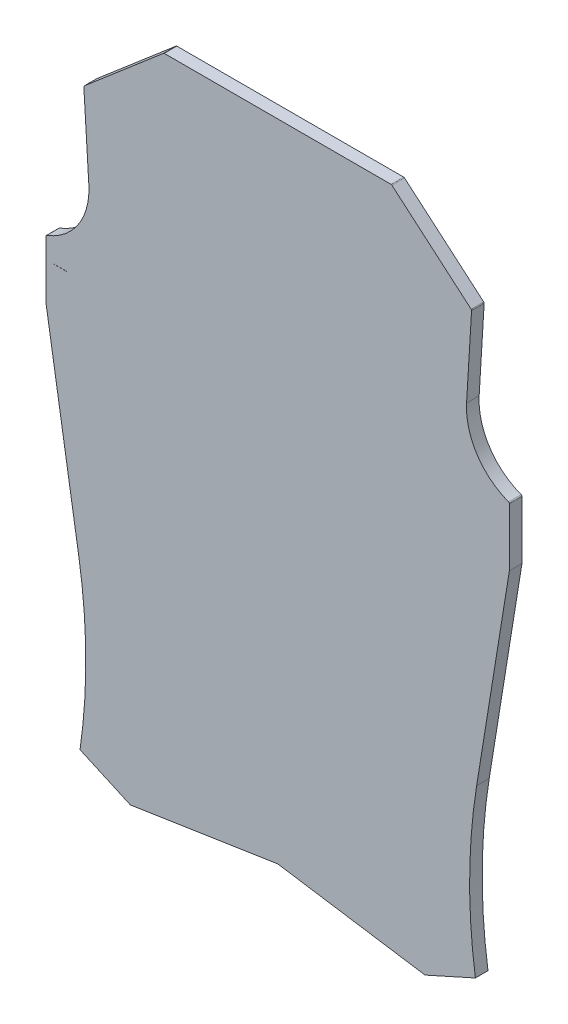
ISO-10303-21;
HEADER;
FILE_DESCRIPTION(('STEP AP214'),'2;1');
FILE_NAME('part.step','',(''),(''),'','','');
FILE_SCHEMA(('AUTOMOTIVE_DESIGN { 1 0 10303 214 1 1 1 1 }'));
ENDSEC;
DATA;
#1=APPLICATION_CONTEXT('core data for automotive mechanical design processes');
#2=APPLICATION_PROTOCOL_DEFINITION('international standard','automotive_design',2000,#1);
#3=PRODUCT_CONTEXT('',#1,'mechanical');
#4=PRODUCT('Part','Part','',(#3));
#5=PRODUCT_RELATED_PRODUCT_CATEGORY('part','',(#4));
#6=PRODUCT_DEFINITION_FORMATION('','',#4);
#7=PRODUCT_DEFINITION_CONTEXT('part definition',#1,'design');
#8=PRODUCT_DEFINITION('design','',#6,#7);
#9=PRODUCT_DEFINITION_SHAPE('','',#8);
#10=(LENGTH_UNIT() NAMED_UNIT(*) SI_UNIT(.MILLI.,.METRE.));
#11=(NAMED_UNIT(*) PLANE_ANGLE_UNIT() SI_UNIT($,.RADIAN.));
#12=(NAMED_UNIT(*) SI_UNIT($,.STERADIAN.) SOLID_ANGLE_UNIT());
#13=UNCERTAINTY_MEASURE_WITH_UNIT(LENGTH_MEASURE(1.E-05),#10,'distance_accuracy_value','');
#14=(GEOMETRIC_REPRESENTATION_CONTEXT(3) GLOBAL_UNCERTAINTY_ASSIGNED_CONTEXT((#13)) GLOBAL_UNIT_ASSIGNED_CONTEXT((#10,
#11,#12)) REPRESENTATION_CONTEXT('',''));
#15=CARTESIAN_POINT('',(0.,0.,0.));
#16=DIRECTION('',(0.,0.,1.));
#17=DIRECTION('',(1.,0.,0.));
#18=AXIS2_PLACEMENT_3D('',#15,#16,#17);
#19=CARTESIAN_POINT('',(-81.9999999982469,-43.2999988699775,5.));
#20=DIRECTION('',(0.00811581332094345,-0.999967066244754,0.));
#21=DIRECTION('',(0.999967066244754,0.00811581332094345,0.));
#22=AXIS2_PLACEMENT_3D('',#19,#20,#21);
#23=PLANE('',#22);
#24=DIRECTION('',(-0.999967066244754,-0.00811581332094345,0.));
#25=VECTOR('',#24,1.);
#26=CARTESIAN_POINT('',(-81.9999999982469,-43.2999988699775,0.));
#27=LINE('',#26,#25);
#28=CARTESIAN_POINT('',(-83.6296001949522,-43.3132248365425,0.));
#29=VERTEX_POINT('',#28);
#30=CARTESIAN_POINT('',(-91.9933779749734,-43.3811059312423,0.));
#31=VERTEX_POINT('',#30);
#32=EDGE_CURVE('E890',#29,#31,#27,.T.);
#33=ORIENTED_EDGE('',*,*,#32,.F.);
#34=DIRECTION('',(0.,0.,1.));
#35=VECTOR('',#34,1.);
#36=CARTESIAN_POINT('',(-83.6296001949522,-43.3132248365425,5.));
#37=LINE('',#36,#35);
#38=CARTESIAN_POINT('',(-83.6296001949522,-43.3132248365425,5.));
#39=VERTEX_POINT('',#38);
#40=EDGE_CURVE('E790',#29,#39,#37,.T.);
#41=ORIENTED_EDGE('',*,*,#40,.T.);
#42=DIRECTION('',(-0.999967066244754,-0.00811581332094345,0.));
#43=VECTOR('',#42,1.);
#44=CARTESIAN_POINT('',(-81.9999999982469,-43.2999988699775,5.));
#45=LINE('',#44,#43);
#46=CARTESIAN_POINT('',(-91.9933779749734,-43.3811059312423,5.));
#47=VERTEX_POINT('',#46);
#48=EDGE_CURVE('E802',#39,#47,#45,.T.);
#49=ORIENTED_EDGE('',*,*,#48,.T.);
#50=DIRECTION('',(0.,0.,-1.));
#51=VECTOR('',#50,1.);
#52=CARTESIAN_POINT('',(-91.9933779749734,-43.3811059312423,5.));
#53=LINE('',#52,#51);
#54=EDGE_CURVE('E12',#47,#31,#53,.T.);
#55=ORIENTED_EDGE('',*,*,#54,.T.);
#56=EDGE_LOOP('',(#33,#41,#49,#55));
#57=FACE_BOUND('',#56,.T.);
#58=ADVANCED_FACE('F549',(#57),#23,.T.);
#59=CARTESIAN_POINT('',(-294.37088942665,-173.62365127446,5.));
#60=DIRECTION('',(0.,0.,-1.));
#61=DIRECTION('',(-1.,0.,0.));
#62=AXIS2_PLACEMENT_3D('',#59,#60,#61);
#63=CYLINDRICAL_SURFACE('',#62,228.168069847329);
#64=CARTESIAN_POINT('',(-294.37088942665,-173.62365127446,5.));
#65=DIRECTION('',(0.,0.,1.));
#66=DIRECTION('',(1.,0.,0.));
#67=AXIS2_PLACEMENT_3D('',#64,#65,#66);
#68=CIRCLE('',#67,228.168069847329);
#69=CARTESIAN_POINT('',(-68.9999179184498,-138.006333866975,5.));
#70=VERTEX_POINT('',#69);
#71=CARTESIAN_POINT('',(-68.9902374176348,-138.067641967358,5.));
#72=VERTEX_POINT('',#71);
#73=EDGE_CURVE('E806',#70,#72,#68,.F.);
#74=ORIENTED_EDGE('',*,*,#73,.T.);
#75=DIRECTION('',(0.,0.,-1.));
#76=VECTOR('',#75,1.);
#77=CARTESIAN_POINT('',(-68.9902374176348,-138.067641967358,5.));
#78=LINE('',#77,#76);
#79=CARTESIAN_POINT('',(-68.9902374176348,-138.067641967358,0.));
#80=VERTEX_POINT('',#79);
#81=EDGE_CURVE('E794',#72,#80,#78,.T.);
#82=ORIENTED_EDGE('',*,*,#81,.T.);
#83=CARTESIAN_POINT('',(-294.37088942665,-173.62365127446,0.));
#84=DIRECTION('',(0.,0.,1.));
#85=DIRECTION('',(1.,0.,0.));
#86=AXIS2_PLACEMENT_3D('',#83,#84,#85);
#87=CIRCLE('',#86,228.168069847329);
#88=CARTESIAN_POINT('',(-68.9999179184498,-138.006333866975,0.));
#89=VERTEX_POINT('',#88);
#90=EDGE_CURVE('E772',#89,#80,#87,.F.);
#91=ORIENTED_EDGE('',*,*,#90,.F.);
#92=DIRECTION('',(0.,0.,-1.));
#93=VECTOR('',#92,1.);
#94=CARTESIAN_POINT('',(-68.9999179184498,-138.006333866975,5.));
#95=LINE('',#94,#93);
#96=EDGE_CURVE('E759',#89,#70,#95,.F.);
#97=ORIENTED_EDGE('',*,*,#96,.T.);
#98=EDGE_LOOP('',(#74,#82,#91,#97));
#99=FACE_BOUND('',#98,.T.);
#100=ADVANCED_FACE('F1210',(#99),#63,.T.);
#101=CARTESIAN_POINT('',(-91.9966889876257,-43.3816502251422,5.));
#102=DIRECTION('',(0.000220464357492817,0.999999975697733,0.));
#103=DIRECTION('',(-0.999999975697733,0.000220464357492817,0.));
#104=AXIS2_PLACEMENT_3D('',#101,#102,#103);
#105=PLANE('',#104);
#106=DIRECTION('',(0.999999975697733,-0.000220464357492817,0.));
#107=VECTOR('',#106,1.);
#108=CARTESIAN_POINT('',(-91.9966889876257,-43.3816502251422,5.));
#109=LINE('',#108,#107);
#110=CARTESIAN_POINT('',(-91.9966889876257,-43.3816502251422,5.));
#111=VERTEX_POINT('',#110);
#112=CARTESIAN_POINT('',(-83.6296001949522,-43.3834948700418,5.));
#113=VERTEX_POINT('',#112);
#114=EDGE_CURVE('E810',#111,#113,#109,.T.);
#115=ORIENTED_EDGE('',*,*,#114,.T.);
#116=DIRECTION('',(0.,0.,-1.));
#117=VECTOR('',#116,1.);
#118=CARTESIAN_POINT('',(-83.6296001949522,-43.3834948700418,5.));
#119=LINE('',#118,#117);
#120=CARTESIAN_POINT('',(-83.6296001949522,-43.3834948700418,0.));
#121=VERTEX_POINT('',#120);
#122=EDGE_CURVE('E787',#113,#121,#119,.T.);
#123=ORIENTED_EDGE('',*,*,#122,.T.);
#124=DIRECTION('',(0.999999975697733,-0.000220464357492817,0.));
#125=VECTOR('',#124,1.);
#126=CARTESIAN_POINT('',(-91.9966889876257,-43.3816502251422,0.));
#127=LINE('',#126,#125);
#128=CARTESIAN_POINT('',(-91.9966889876257,-43.3816502251422,0.));
#129=VERTEX_POINT('',#128);
#130=EDGE_CURVE('E895',#129,#121,#127,.T.);
#131=ORIENTED_EDGE('',*,*,#130,.F.);
#132=DIRECTION('',(0.,0.,-1.));
#133=VECTOR('',#132,1.);
#134=CARTESIAN_POINT('',(-91.9966889876257,-43.3816502251422,5.));
#135=LINE('',#134,#133);
#136=EDGE_CURVE('E558',#111,#129,#135,.T.);
#137=ORIENTED_EDGE('',*,*,#136,.F.);
#138=EDGE_LOOP('',(#115,#123,#131,#137));
#139=FACE_BOUND('',#138,.T.);
#140=ADVANCED_FACE('F1077',(#139),#105,.T.);
#141=CARTESIAN_POINT('',(-91.4999999982474,-43.3000000000009,5.));
#142=DIRECTION('',(0.,0.,-1.));
#143=DIRECTION('',(-1.,0.,0.));
#144=AXIS2_PLACEMENT_3D('',#141,#142,#143);
#145=CYLINDRICAL_SURFACE('',#144,0.500000000000781);
#146=CARTESIAN_POINT('',(-91.4999999982474,-43.3000000000009,0.));
#147=DIRECTION('',(0.,0.,1.));
#148=DIRECTION('',(1.,0.,0.));
#149=AXIS2_PLACEMENT_3D('',#146,#147,#148);
#150=CIRCLE('',#149,0.500000000000781);
#151=CARTESIAN_POINT('',(-91.9999999982469,-43.2999988699775,0.));
#152=VERTEX_POINT('',#151);
#153=EDGE_CURVE('E797',#152,#31,#150,.T.);
#154=ORIENTED_EDGE('',*,*,#153,.T.);
#155=ORIENTED_EDGE('',*,*,#54,.F.);
#156=CARTESIAN_POINT('',(-91.4999999982474,-43.3000000000009,5.));
#157=DIRECTION('',(0.,0.,1.));
#158=DIRECTION('',(1.,0.,0.));
#159=AXIS2_PLACEMENT_3D('',#156,#157,#158);
#160=CIRCLE('',#159,0.500000000000781);
#161=CARTESIAN_POINT('',(-91.9999999982469,-43.2999988699775,5.));
#162=VERTEX_POINT('',#161);
#163=EDGE_CURVE('E798',#162,#47,#160,.T.);
#164=ORIENTED_EDGE('',*,*,#163,.F.);
#165=DIRECTION('',(0.,0.,-1.));
#166=VECTOR('',#165,1.);
#167=CARTESIAN_POINT('',(-91.9999999982469,-43.2999988699775,5.));
#168=LINE('',#167,#166);
#169=EDGE_CURVE('E886',#162,#152,#168,.T.);
#170=ORIENTED_EDGE('',*,*,#169,.T.);
#171=EDGE_LOOP('',(#154,#155,#164,#170));
#172=FACE_BOUND('',#171,.T.);
#173=ADVANCED_FACE('F551',(#172),#145,.T.);
#174=CARTESIAN_POINT('',(-91.9966889876257,-43.3816502251422,5.));
#175=DIRECTION('',(0.999999975697733,-0.000220464357492976,0.));
#176=DIRECTION('',(0.000220464357492976,0.999999975697733,0.));
#177=AXIS2_PLACEMENT_3D('',#174,#175,#176);
#178=PLANE('',#177);
#179=DIRECTION('',(-0.000220464357492976,-0.999999975697733,0.));
#180=VECTOR('',#179,1.);
#181=CARTESIAN_POINT('',(-91.9966889876257,-43.3816502251422,0.));
#182=LINE('',#181,#180);
#183=CARTESIAN_POINT('',(-91.9999999985399,-58.4000000001,0.));
#184=VERTEX_POINT('',#183);
#185=EDGE_CURVE('E899',#129,#184,#182,.T.);
#186=ORIENTED_EDGE('',*,*,#185,.T.);
#187=DIRECTION('',(0.,0.,-1.));
#188=VECTOR('',#187,1.);
#189=CARTESIAN_POINT('',(-91.9999999985399,-58.4000000001,5.));
#190=LINE('',#189,#188);
#191=CARTESIAN_POINT('',(-91.9999999985399,-58.4000000001,5.));
#192=VERTEX_POINT('',#191);
#193=EDGE_CURVE('E1062',#192,#184,#190,.T.);
#194=ORIENTED_EDGE('',*,*,#193,.F.);
#195=DIRECTION('',(-0.000220464357492976,-0.999999975697733,0.));
#196=VECTOR('',#195,1.);
#197=CARTESIAN_POINT('',(-91.9966889876257,-43.3816502251422,5.));
#198=LINE('',#197,#196);
#199=EDGE_CURVE('E814',#111,#192,#198,.T.);
#200=ORIENTED_EDGE('',*,*,#199,.F.);
#201=ORIENTED_EDGE('',*,*,#136,.T.);
#202=EDGE_LOOP('',(#186,#194,#200,#201));
#203=FACE_BOUND('',#202,.T.);
#204=ADVANCED_FACE('F1069',(#203),#178,.F.);
#205=CARTESIAN_POINT('',(-91.9999999985399,-58.4000000001,5.));
#206=DIRECTION('',(0.987178781836989,0.15961845974335,0.));
#207=DIRECTION('',(-0.15961845974335,0.987178781836989,0.));
#208=AXIS2_PLACEMENT_3D('',#205,#206,#207);
#209=PLANE('',#208);
#210=DIRECTION('',(0.15961845974335,-0.987178781836989,0.));
#211=VECTOR('',#210,1.);
#212=CARTESIAN_POINT('',(-91.9999999985399,-58.4000000001,0.));
#213=LINE('',#212,#211);
#214=CARTESIAN_POINT('',(-79.0000000055876,-138.799999959736,0.));
#215=VERTEX_POINT('',#214);
#216=EDGE_CURVE('E902',#184,#215,#213,.T.);
#217=ORIENTED_EDGE('',*,*,#216,.T.);
#218=DIRECTION('',(0.,0.,-1.));
#219=VECTOR('',#218,1.);
#220=CARTESIAN_POINT('',(-79.0000000055876,-138.799999959736,5.));
#221=LINE('',#220,#219);
#222=CARTESIAN_POINT('',(-79.0000000055876,-138.799999959736,5.));
#223=VERTEX_POINT('',#222);
#224=EDGE_CURVE('E1058',#223,#215,#221,.T.);
#225=ORIENTED_EDGE('',*,*,#224,.F.);
#226=DIRECTION('',(0.15961845974335,-0.987178781836989,0.));
#227=VECTOR('',#226,1.);
#228=CARTESIAN_POINT('',(-91.9999999985399,-58.4000000001,5.));
#229=LINE('',#228,#227);
#230=EDGE_CURVE('E817',#192,#223,#229,.T.);
#231=ORIENTED_EDGE('',*,*,#230,.F.);
#232=ORIENTED_EDGE('',*,*,#193,.T.);
#233=EDGE_LOOP('',(#217,#225,#231,#232));
#234=FACE_BOUND('',#233,.T.);
#235=ADVANCED_FACE('F1200',(#234),#209,.F.);
#236=CARTESIAN_POINT('',(-294.37088942665,-173.62365127446,5.));
#237=DIRECTION('',(0.,0.,-1.));
#238=DIRECTION('',(-1.,0.,0.));
#239=AXIS2_PLACEMENT_3D('',#236,#237,#238);
#240=CYLINDRICAL_SURFACE('',#239,218.168069847329);
#241=CARTESIAN_POINT('',(-294.37088942665,-173.62365127446,0.));
#242=DIRECTION('',(0.,0.,-1.));
#243=DIRECTION('',(1.,0.,0.));
#244=AXIS2_PLACEMENT_3D('',#241,#242,#243);
#245=CIRCLE('',#244,218.168069847329);
#246=CARTESIAN_POINT('',(-78.4999999992825,-205.199999998572,0.));
#247=VERTEX_POINT('',#246);
#248=EDGE_CURVE('E905',#215,#247,#245,.T.);
#249=ORIENTED_EDGE('',*,*,#248,.T.);
#250=DIRECTION('',(0.,0.,-1.));
#251=VECTOR('',#250,1.);
#252=CARTESIAN_POINT('',(-78.4999999992825,-205.199999998572,5.));
#253=LINE('',#252,#251);
#254=CARTESIAN_POINT('',(-78.4999999992825,-205.199999998572,5.));
#255=VERTEX_POINT('',#254);
#256=EDGE_CURVE('E1054',#255,#247,#253,.T.);
#257=ORIENTED_EDGE('',*,*,#256,.F.);
#258=CARTESIAN_POINT('',(-294.37088942665,-173.62365127446,5.));
#259=DIRECTION('',(0.,0.,-1.));
#260=DIRECTION('',(1.,0.,0.));
#261=AXIS2_PLACEMENT_3D('',#258,#259,#260);
#262=CIRCLE('',#261,218.168069847329);
#263=EDGE_CURVE('E820',#223,#255,#262,.T.);
#264=ORIENTED_EDGE('',*,*,#263,.F.);
#265=ORIENTED_EDGE('',*,*,#224,.T.);
#266=EDGE_LOOP('',(#249,#257,#264,#265));
#267=FACE_BOUND('',#266,.T.);
#268=ADVANCED_FACE('F1196',(#267),#240,.F.);
#269=CARTESIAN_POINT('',(-78.4999999992825,-205.199999998572,5.));
#270=DIRECTION('',(0.410364677356085,0.911921505162827,0.));
#271=DIRECTION('',(-0.911921505162827,0.410364677356085,0.));
#272=AXIS2_PLACEMENT_3D('',#269,#270,#271);
#273=PLANE('',#272);
#274=DIRECTION('',(0.911921505162827,-0.410364677356085,0.));
#275=VECTOR('',#274,1.);
#276=CARTESIAN_POINT('',(-78.4999999992825,-205.199999998572,0.));
#277=LINE('',#276,#275);
#278=CARTESIAN_POINT('',(-58.4999999984207,-214.199999999679,0.));
#279=VERTEX_POINT('',#278);
#280=EDGE_CURVE('E908',#247,#279,#277,.T.);
#281=ORIENTED_EDGE('',*,*,#280,.T.);
#282=DIRECTION('',(0.,0.,-1.));
#283=VECTOR('',#282,1.);
#284=CARTESIAN_POINT('',(-58.4999999984207,-214.199999999679,5.));
#285=LINE('',#284,#283);
#286=CARTESIAN_POINT('',(-58.4999999984207,-214.199999999679,5.));
#287=VERTEX_POINT('',#286);
#288=EDGE_CURVE('E1050',#287,#279,#285,.T.);
#289=ORIENTED_EDGE('',*,*,#288,.F.);
#290=DIRECTION('',(0.911921505162827,-0.410364677356085,0.));
#291=VECTOR('',#290,1.);
#292=CARTESIAN_POINT('',(-78.4999999992825,-205.199999998572,5.));
#293=LINE('',#292,#291);
#294=EDGE_CURVE('E823',#255,#287,#293,.T.);
#295=ORIENTED_EDGE('',*,*,#294,.F.);
#296=ORIENTED_EDGE('',*,*,#256,.T.);
#297=EDGE_LOOP('',(#281,#289,#295,#296));
#298=FACE_BOUND('',#297,.T.);
#299=ADVANCED_FACE('F1191',(#298),#273,.F.);
#300=CARTESIAN_POINT('',(-58.4999999984207,-214.199999999679,5.));
#301=DIRECTION('',(-0.15205718427004,0.98837169764814,0.));
#302=DIRECTION('',(-0.98837169764814,-0.15205718427004,0.));
#303=AXIS2_PLACEMENT_3D('',#300,#301,#302);
#304=PLANE('',#303);
#305=DIRECTION('',(0.98837169764814,0.15205718427004,0.));
#306=VECTOR('',#305,1.);
#307=CARTESIAN_POINT('',(-58.4999999984207,-214.199999999679,0.));
#308=LINE('',#307,#306);
#309=CARTESIAN_POINT('',(1.59900452976804E-09,-205.1999999987,0.));
#310=VERTEX_POINT('',#309);
#311=EDGE_CURVE('E911',#279,#310,#308,.T.);
#312=ORIENTED_EDGE('',*,*,#311,.T.);
#313=DIRECTION('',(0.,0.,-1.));
#314=VECTOR('',#313,1.);
#315=CARTESIAN_POINT('',(1.59900452976804E-09,-205.1999999987,5.));
#316=LINE('',#315,#314);
#317=CARTESIAN_POINT('',(1.59900452976804E-09,-205.1999999987,5.));
#318=VERTEX_POINT('',#317);
#319=EDGE_CURVE('E1046',#318,#310,#316,.T.);
#320=ORIENTED_EDGE('',*,*,#319,.F.);
#321=DIRECTION('',(0.98837169764814,0.15205718427004,0.));
#322=VECTOR('',#321,1.);
#323=CARTESIAN_POINT('',(-58.4999999984207,-214.199999999679,5.));
#324=LINE('',#323,#322);
#325=EDGE_CURVE('E826',#287,#318,#324,.T.);
#326=ORIENTED_EDGE('',*,*,#325,.F.);
#327=ORIENTED_EDGE('',*,*,#288,.T.);
#328=EDGE_LOOP('',(#312,#320,#326,#327));
#329=FACE_BOUND('',#328,.T.);
#330=ADVANCED_FACE('F1187',(#329),#304,.F.);
#331=CARTESIAN_POINT('',(1.59900452976804E-09,-205.1999999987,5.));
#332=DIRECTION('',(0.152057184270048,0.988371697648139,0.));
#333=DIRECTION('',(-0.988371697648139,0.152057184270048,0.));
#334=AXIS2_PLACEMENT_3D('',#331,#332,#333);
#335=PLANE('',#334);
#336=DIRECTION('',(0.988371697648139,-0.152057184270048,0.));
#337=VECTOR('',#336,1.);
#338=CARTESIAN_POINT('',(1.59900452976804E-09,-205.1999999987,0.));
#339=LINE('',#338,#337);
#340=CARTESIAN_POINT('',(58.5000000016189,-214.199999999679,0.));
#341=VERTEX_POINT('',#340);
#342=EDGE_CURVE('E914',#310,#341,#339,.T.);
#343=ORIENTED_EDGE('',*,*,#342,.T.);
#344=DIRECTION('',(0.,0.,-1.));
#345=VECTOR('',#344,1.);
#346=CARTESIAN_POINT('',(58.5000000016189,-214.199999999679,5.));
#347=LINE('',#346,#345);
#348=CARTESIAN_POINT('',(58.5000000016189,-214.199999999679,5.));
#349=VERTEX_POINT('',#348);
#350=EDGE_CURVE('E1042',#349,#341,#347,.T.);
#351=ORIENTED_EDGE('',*,*,#350,.F.);
#352=DIRECTION('',(0.988371697648139,-0.152057184270048,0.));
#353=VECTOR('',#352,1.);
#354=CARTESIAN_POINT('',(1.59900452976804E-09,-205.1999999987,5.));
#355=LINE('',#354,#353);
#356=EDGE_CURVE('E829',#318,#349,#355,.T.);
#357=ORIENTED_EDGE('',*,*,#356,.F.);
#358=ORIENTED_EDGE('',*,*,#319,.T.);
#359=EDGE_LOOP('',(#343,#351,#357,#358));
#360=FACE_BOUND('',#359,.T.);
#361=ADVANCED_FACE('F1183',(#360),#335,.F.);
#362=CARTESIAN_POINT('',(58.5000000016189,-214.199999999679,5.));
#363=DIRECTION('',(-0.410364675741171,0.911921505889538,0.));
#364=DIRECTION('',(-0.911921505889538,-0.410364675741171,0.));
#365=AXIS2_PLACEMENT_3D('',#362,#363,#364);
#366=PLANE('',#365);
#367=DIRECTION('',(0.911921505889538,0.410364675741171,0.));
#368=VECTOR('',#367,1.);
#369=CARTESIAN_POINT('',(58.5000000016189,-214.199999999679,0.));
#370=LINE('',#369,#368);
#371=CARTESIAN_POINT('',(78.5000000074265,-205.200000038936,0.));
#372=VERTEX_POINT('',#371);
#373=EDGE_CURVE('E917',#341,#372,#370,.T.);
#374=ORIENTED_EDGE('',*,*,#373,.T.);
#375=DIRECTION('',(0.,0.,-1.));
#376=VECTOR('',#375,1.);
#377=CARTESIAN_POINT('',(78.5000000074265,-205.200000038936,5.));
#378=LINE('',#377,#376);
#379=CARTESIAN_POINT('',(78.5000000074265,-205.200000038936,5.));
#380=VERTEX_POINT('',#379);
#381=EDGE_CURVE('E1038',#380,#372,#378,.T.);
#382=ORIENTED_EDGE('',*,*,#381,.F.);
#383=DIRECTION('',(0.911921505889538,0.410364675741171,0.));
#384=VECTOR('',#383,1.);
#385=CARTESIAN_POINT('',(58.5000000016189,-214.199999999679,5.));
#386=LINE('',#385,#384);
#387=EDGE_CURVE('E832',#349,#380,#386,.T.);
#388=ORIENTED_EDGE('',*,*,#387,.F.);
#389=ORIENTED_EDGE('',*,*,#350,.T.);
#390=EDGE_LOOP('',(#374,#382,#388,#389));
#391=FACE_BOUND('',#390,.T.);
#392=ADVANCED_FACE('F1179',(#391),#366,.F.);
#393=CARTESIAN_POINT('',(294.37088942985,-173.62365127446,5.));
#394=DIRECTION('',(0.,0.,-1.));
#395=DIRECTION('',(-1.,0.,0.));
#396=AXIS2_PLACEMENT_3D('',#393,#394,#395);
#397=CYLINDRICAL_SURFACE('',#396,218.16806984828);
#398=CARTESIAN_POINT('',(294.37088942985,-173.62365127446,0.));
#399=DIRECTION('',(0.,0.,-1.));
#400=DIRECTION('',(1.,0.,0.));
#401=AXIS2_PLACEMENT_3D('',#398,#399,#400);
#402=CIRCLE('',#401,218.16806984828);
#403=CARTESIAN_POINT('',(79.000000001508,-138.799999998799,0.));
#404=VERTEX_POINT('',#403);
#405=EDGE_CURVE('E920',#372,#404,#402,.T.);
#406=ORIENTED_EDGE('',*,*,#405,.T.);
#407=DIRECTION('',(0.,0.,-1.));
#408=VECTOR('',#407,1.);
#409=CARTESIAN_POINT('',(79.000000001508,-138.799999998799,5.));
#410=LINE('',#409,#408);
#411=CARTESIAN_POINT('',(79.000000001508,-138.799999998799,5.));
#412=VERTEX_POINT('',#411);
#413=EDGE_CURVE('E1034',#412,#404,#410,.T.);
#414=ORIENTED_EDGE('',*,*,#413,.F.);
#415=CARTESIAN_POINT('',(294.37088942985,-173.62365127446,5.));
#416=DIRECTION('',(0.,0.,-1.));
#417=DIRECTION('',(1.,0.,0.));
#418=AXIS2_PLACEMENT_3D('',#415,#416,#417);
#419=CIRCLE('',#418,218.16806984828);
#420=EDGE_CURVE('E835',#380,#412,#419,.T.);
#421=ORIENTED_EDGE('',*,*,#420,.F.);
#422=ORIENTED_EDGE('',*,*,#381,.T.);
#423=EDGE_LOOP('',(#406,#414,#421,#422));
#424=FACE_BOUND('',#423,.T.);
#425=ADVANCED_FACE('F1174',(#424),#397,.F.);
#426=CARTESIAN_POINT('',(79.000000001508,-138.799999998799,5.));
#427=DIRECTION('',(-0.987178781835123,0.159618459754888,0.));
#428=DIRECTION('',(-0.159618459754888,-0.987178781835123,0.));
#429=AXIS2_PLACEMENT_3D('',#426,#427,#428);
#430=PLANE('',#429);
#431=DIRECTION('',(0.159618459754888,0.987178781835123,0.));
#432=VECTOR('',#431,1.);
#433=CARTESIAN_POINT('',(79.000000001508,-138.799999998799,0.));
#434=LINE('',#433,#432);
#435=CARTESIAN_POINT('',(92.0000000017398,-58.4000000001,0.));
#436=VERTEX_POINT('',#435);
#437=EDGE_CURVE('E923',#404,#436,#434,.T.);
#438=ORIENTED_EDGE('',*,*,#437,.T.);
#439=DIRECTION('',(0.,0.,-1.));
#440=VECTOR('',#439,1.);
#441=CARTESIAN_POINT('',(92.0000000017398,-58.4000000001,5.));
#442=LINE('',#441,#440);
#443=CARTESIAN_POINT('',(92.0000000017398,-58.4000000001,5.));
#444=VERTEX_POINT('',#443);
#445=EDGE_CURVE('E1030',#444,#436,#442,.T.);
#446=ORIENTED_EDGE('',*,*,#445,.F.);
#447=DIRECTION('',(0.159618459754888,0.987178781835123,0.));
#448=VECTOR('',#447,1.);
#449=CARTESIAN_POINT('',(79.000000001508,-138.799999998799,5.));
#450=LINE('',#449,#448);
#451=EDGE_CURVE('E838',#412,#444,#450,.T.);
#452=ORIENTED_EDGE('',*,*,#451,.F.);
#453=ORIENTED_EDGE('',*,*,#413,.T.);
#454=EDGE_LOOP('',(#438,#446,#452,#453));
#455=FACE_BOUND('',#454,.T.);
#456=ADVANCED_FACE('F1165',(#455),#430,.F.);
#457=CARTESIAN_POINT('',(92.00000000174,-45.700000000099,5.));
#458=DIRECTION('',(-1.,0.,0.));
#459=DIRECTION('',(0.,-1.,0.));
#460=AXIS2_PLACEMENT_3D('',#457,#458,#459);
#461=PLANE('',#460);
#462=DIRECTION('',(0.,1.,0.));
#463=VECTOR('',#462,1.);
#464=CARTESIAN_POINT('',(92.00000000174,-45.700000000099,0.));
#465=LINE('',#464,#463);
#466=CARTESIAN_POINT('',(92.0000000017394,-35.3490957216169,0.));
#467=VERTEX_POINT('',#466);
#468=EDGE_CURVE('E927',#436,#467,#465,.T.);
#469=ORIENTED_EDGE('',*,*,#468,.T.);
#470=DIRECTION('',(0.,0.,-1.));
#471=VECTOR('',#470,1.);
#472=CARTESIAN_POINT('',(92.0000000017394,-35.3490957216169,5.));
#473=LINE('',#472,#471);
#474=CARTESIAN_POINT('',(92.0000000017394,-35.3490957216169,5.));
#475=VERTEX_POINT('',#474);
#476=EDGE_CURVE('E1026',#475,#467,#473,.T.);
#477=ORIENTED_EDGE('',*,*,#476,.F.);
#478=DIRECTION('',(0.,1.,0.));
#479=VECTOR('',#478,1.);
#480=CARTESIAN_POINT('',(92.0000000017398,-58.4000000001,5.));
#481=LINE('',#480,#479);
#482=EDGE_CURVE('E841',#444,#475,#481,.T.);
#483=ORIENTED_EDGE('',*,*,#482,.F.);
#484=ORIENTED_EDGE('',*,*,#445,.T.);
#485=EDGE_LOOP('',(#469,#477,#483,#484));
#486=FACE_BOUND('',#485,.T.);
#487=ADVANCED_FACE('F1169',(#486),#461,.F.);
#488=CARTESIAN_POINT('',(91.5000000017394,-35.349095575733,5.));
#489=DIRECTION('',(0.,0.,-1.));
#490=DIRECTION('',(-1.,0.,0.));
#491=AXIS2_PLACEMENT_3D('',#488,#489,#490);
#492=CYLINDRICAL_SURFACE('',#491,0.499999999999994);
#493=CARTESIAN_POINT('',(91.5000000017394,-35.349095575733,0.));
#494=DIRECTION('',(0.,0.,1.));
#495=DIRECTION('',(1.,0.,0.));
#496=AXIS2_PLACEMENT_3D('',#493,#494,#495);
#497=CIRCLE('',#496,0.499999999999994);
#498=CARTESIAN_POINT('',(91.6754131772061,-34.8808753093277,0.));
#499=VERTEX_POINT('',#498);
#500=EDGE_CURVE('E930',#467,#499,#497,.T.);
#501=ORIENTED_EDGE('',*,*,#500,.T.);
#502=DIRECTION('',(0.,0.,-1.));
#503=VECTOR('',#502,1.);
#504=CARTESIAN_POINT('',(91.6754131772061,-34.8808753093277,5.));
#505=LINE('',#504,#503);
#506=CARTESIAN_POINT('',(91.6754131772061,-34.8808753093277,5.));
#507=VERTEX_POINT('',#506);
#508=EDGE_CURVE('E1022',#507,#499,#505,.T.);
#509=ORIENTED_EDGE('',*,*,#508,.F.);
#510=CARTESIAN_POINT('',(91.5000000017394,-35.349095575733,5.));
#511=DIRECTION('',(0.,0.,1.));
#512=DIRECTION('',(1.,0.,0.));
#513=AXIS2_PLACEMENT_3D('',#510,#511,#512);
#514=CIRCLE('',#513,0.499999999999994);
#515=EDGE_CURVE('E844',#475,#507,#514,.T.);
#516=ORIENTED_EDGE('',*,*,#515,.F.);
#517=ORIENTED_EDGE('',*,*,#476,.T.);
#518=EDGE_LOOP('',(#501,#509,#516,#517));
#519=FACE_BOUND('',#518,.T.);
#520=ADVANCED_FACE('F1158',(#519),#492,.T.);
#521=CARTESIAN_POINT('',(100.712634673639,-10.7583414952655,5.));
#522=DIRECTION('',(0.,0.,-1.));
#523=DIRECTION('',(-1.,0.,0.));
#524=AXIS2_PLACEMENT_3D('',#521,#522,#523);
#525=CYLINDRICAL_SURFACE('',#524,25.7598138577546);
#526=CARTESIAN_POINT('',(100.712634673639,-10.7583414952655,0.));
#527=DIRECTION('',(0.,0.,-1.));
#528=DIRECTION('',(1.,0.,0.));
#529=AXIS2_PLACEMENT_3D('',#526,#527,#528);
#530=CIRCLE('',#529,25.7598138577546);
#531=CARTESIAN_POINT('',(75.0000000017451,-9.19999999999813,0.));
#532=VERTEX_POINT('',#531);
#533=EDGE_CURVE('E933',#499,#532,#530,.T.);
#534=ORIENTED_EDGE('',*,*,#533,.T.);
#535=DIRECTION('',(0.,0.,-1.));
#536=VECTOR('',#535,1.);
#537=CARTESIAN_POINT('',(75.0000000017451,-9.19999999999813,5.));
#538=LINE('',#537,#536);
#539=CARTESIAN_POINT('',(75.0000000017451,-9.19999999999813,5.));
#540=VERTEX_POINT('',#539);
#541=EDGE_CURVE('E1018',#540,#532,#538,.T.);
#542=ORIENTED_EDGE('',*,*,#541,.F.);
#543=CARTESIAN_POINT('',(100.712634673639,-10.7583414952655,5.));
#544=DIRECTION('',(0.,0.,-1.));
#545=DIRECTION('',(1.,0.,0.));
#546=AXIS2_PLACEMENT_3D('',#543,#544,#545);
#547=CIRCLE('',#546,25.7598138577546);
#548=EDGE_CURVE('E847',#507,#540,#547,.T.);
#549=ORIENTED_EDGE('',*,*,#548,.F.);
#550=ORIENTED_EDGE('',*,*,#508,.T.);
#551=EDGE_LOOP('',(#534,#542,#549,#550));
#552=FACE_BOUND('',#551,.T.);
#553=ADVANCED_FACE('F1154',(#552),#525,.F.);
#554=CARTESIAN_POINT('',(75.0000000017451,-9.19999999999813,5.));
#555=DIRECTION('',(-0.998168496631189,0.0604950604019224,0.));
#556=DIRECTION('',(-0.0604950604019224,-0.998168496631189,0.));
#557=AXIS2_PLACEMENT_3D('',#554,#555,#556);
#558=PLANE('',#557);
#559=DIRECTION('',(0.0604950604019224,0.998168496631189,0.));
#560=VECTOR('',#559,1.);
#561=CARTESIAN_POINT('',(75.0000000017451,-9.19999999999813,0.));
#562=LINE('',#561,#560);
#563=CARTESIAN_POINT('',(76.9849434053218,23.5515661590003,0.));
#564=VERTEX_POINT('',#563);
#565=EDGE_CURVE('E936',#532,#564,#562,.T.);
#566=ORIENTED_EDGE('',*,*,#565,.T.);
#567=DIRECTION('',(0.,0.,-1.));
#568=VECTOR('',#567,1.);
#569=CARTESIAN_POINT('',(76.9849434053218,23.5515661590003,5.));
#570=LINE('',#569,#568);
#571=CARTESIAN_POINT('',(76.9849434053218,23.5515661590003,5.));
#572=VERTEX_POINT('',#571);
#573=EDGE_CURVE('E1014',#572,#564,#570,.T.);
#574=ORIENTED_EDGE('',*,*,#573,.F.);
#575=DIRECTION('',(0.0604950604019224,0.998168496631189,0.));
#576=VECTOR('',#575,1.);
#577=CARTESIAN_POINT('',(75.0000000017451,-9.19999999999813,5.));
#578=LINE('',#577,#576);
#579=EDGE_CURVE('E850',#540,#572,#578,.T.);
#580=ORIENTED_EDGE('',*,*,#579,.F.);
#581=ORIENTED_EDGE('',*,*,#541,.T.);
#582=EDGE_LOOP('',(#566,#574,#580,#581));
#583=FACE_BOUND('',#582,.T.);
#584=ADVANCED_FACE('F1149',(#583),#558,.F.);
#585=CARTESIAN_POINT('',(76.4858591601915,23.5818137417635,5.));
#586=DIRECTION('',(0.,0.,-1.));
#587=DIRECTION('',(-1.,0.,0.));
#588=AXIS2_PLACEMENT_3D('',#585,#586,#587);
#589=CYLINDRICAL_SURFACE('',#588,0.500000000000233);
#590=CARTESIAN_POINT('',(76.4858591601915,23.5818137417635,0.));
#591=DIRECTION('',(0.,0.,1.));
#592=DIRECTION('',(1.,0.,0.));
#593=AXIS2_PLACEMENT_3D('',#590,#591,#592);
#594=CIRCLE('',#593,0.500000000000233);
#595=CARTESIAN_POINT('',(76.8108610710944,23.9617792111285,0.));
#596=VERTEX_POINT('',#595);
#597=EDGE_CURVE('E939',#564,#596,#594,.T.);
#598=ORIENTED_EDGE('',*,*,#597,.T.);
#599=DIRECTION('',(0.,0.,-1.));
#600=VECTOR('',#599,1.);
#601=CARTESIAN_POINT('',(76.8108610710944,23.9617792111285,5.));
#602=LINE('',#601,#600);
#603=CARTESIAN_POINT('',(76.8108610710944,23.9617792111285,5.));
#604=VERTEX_POINT('',#603);
#605=EDGE_CURVE('E1010',#604,#596,#602,.T.);
#606=ORIENTED_EDGE('',*,*,#605,.F.);
#607=CARTESIAN_POINT('',(76.4858591601915,23.5818137417635,5.));
#608=DIRECTION('',(0.,0.,1.));
#609=DIRECTION('',(1.,0.,0.));
#610=AXIS2_PLACEMENT_3D('',#607,#608,#609);
#611=CIRCLE('',#610,0.500000000000233);
#612=EDGE_CURVE('E853',#572,#604,#611,.T.);
#613=ORIENTED_EDGE('',*,*,#612,.F.);
#614=ORIENTED_EDGE('',*,*,#573,.T.);
#615=EDGE_LOOP('',(#598,#606,#613,#614));
#616=FACE_BOUND('',#615,.T.);
#617=ADVANCED_FACE('F1143',(#616),#589,.T.);
#618=CARTESIAN_POINT('',(76.8108610710944,23.9617792111285,5.));
#619=DIRECTION('',(-0.650003821805966,-0.759930938729065,0.));
#620=DIRECTION('',(0.759930938729065,-0.650003821805966,0.));
#621=AXIS2_PLACEMENT_3D('',#618,#619,#620);
#622=PLANE('',#621);
#623=DIRECTION('',(-0.759930938729065,0.650003821805966,0.));
#624=VECTOR('',#623,1.);
#625=CARTESIAN_POINT('',(76.8108610710944,23.9617792111285,0.));
#626=LINE('',#625,#624);
#627=CARTESIAN_POINT('',(45.3403345008625,50.8799654598791,0.));
#628=VERTEX_POINT('',#627);
#629=EDGE_CURVE('E942',#596,#628,#626,.T.);
#630=ORIENTED_EDGE('',*,*,#629,.T.);
#631=DIRECTION('',(0.,0.,-1.));
#632=VECTOR('',#631,1.);
#633=CARTESIAN_POINT('',(45.3403345008625,50.8799654598791,5.));
#634=LINE('',#633,#632);
#635=CARTESIAN_POINT('',(45.3403345008625,50.8799654598791,5.));
#636=VERTEX_POINT('',#635);
#637=EDGE_CURVE('E1006',#636,#628,#634,.T.);
#638=ORIENTED_EDGE('',*,*,#637,.F.);
#639=DIRECTION('',(-0.759930938729065,0.650003821805966,0.));
#640=VECTOR('',#639,1.);
#641=CARTESIAN_POINT('',(76.8108610710944,23.9617792111285,5.));
#642=LINE('',#641,#640);
#643=EDGE_CURVE('E856',#604,#636,#642,.T.);
#644=ORIENTED_EDGE('',*,*,#643,.F.);
#645=ORIENTED_EDGE('',*,*,#605,.T.);
#646=EDGE_LOOP('',(#630,#638,#644,#645));
#647=FACE_BOUND('',#646,.T.);
#648=ADVANCED_FACE('F1139',(#647),#622,.F.);
#649=CARTESIAN_POINT('',(45.0153325788654,50.5000000000044,5.));
#650=DIRECTION('',(0.,0.,-1.));
#651=DIRECTION('',(-1.,0.,0.));
#652=AXIS2_PLACEMENT_3D('',#649,#650,#651);
#653=CYLINDRICAL_SURFACE('',#652,0.49999999999964);
#654=CARTESIAN_POINT('',(45.0153325788654,50.5000000000044,0.));
#655=DIRECTION('',(0.,0.,1.));
#656=DIRECTION('',(1.,0.,0.));
#657=AXIS2_PLACEMENT_3D('',#654,#655,#656);
#658=CIRCLE('',#657,0.49999999999964);
#659=CARTESIAN_POINT('',(45.0153325788654,51.0000000000041,0.));
#660=VERTEX_POINT('',#659);
#661=EDGE_CURVE('E945',#628,#660,#658,.T.);
#662=ORIENTED_EDGE('',*,*,#661,.T.);
#663=DIRECTION('',(0.,0.,-1.));
#664=VECTOR('',#663,1.);
#665=CARTESIAN_POINT('',(45.0153325788654,51.0000000000041,5.));
#666=LINE('',#665,#664);
#667=CARTESIAN_POINT('',(45.0153325788654,51.0000000000041,5.));
#668=VERTEX_POINT('',#667);
#669=EDGE_CURVE('E1002',#668,#660,#666,.T.);
#670=ORIENTED_EDGE('',*,*,#669,.F.);
#671=CARTESIAN_POINT('',(45.0153325788654,50.5000000000044,5.));
#672=DIRECTION('',(0.,0.,1.));
#673=DIRECTION('',(1.,0.,0.));
#674=AXIS2_PLACEMENT_3D('',#671,#672,#673);
#675=CIRCLE('',#674,0.49999999999964);
#676=EDGE_CURVE('E859',#636,#668,#675,.T.);
#677=ORIENTED_EDGE('',*,*,#676,.F.);
#678=ORIENTED_EDGE('',*,*,#637,.T.);
#679=EDGE_LOOP('',(#662,#670,#677,#678));
#680=FACE_BOUND('',#679,.T.);
#681=ADVANCED_FACE('F1134',(#680),#653,.T.);
#682=CARTESIAN_POINT('',(45.0153325788654,51.0000000000041,5.));
#683=DIRECTION('',(0.,-1.,0.));
#684=DIRECTION('',(0.,0.,-1.));
#685=AXIS2_PLACEMENT_3D('',#682,#683,#684);
#686=PLANE('',#685);
#687=DIRECTION('',(-1.,0.,0.));
#688=VECTOR('',#687,1.);
#689=CARTESIAN_POINT('',(45.0153325788654,51.0000000000041,0.));
#690=LINE('',#689,#688);
#691=CARTESIAN_POINT('',(-45.0153325607747,51.0000000000041,0.));
#692=VERTEX_POINT('',#691);
#693=EDGE_CURVE('E948',#660,#692,#690,.T.);
#694=ORIENTED_EDGE('',*,*,#693,.T.);
#695=DIRECTION('',(0.,0.,-1.));
#696=VECTOR('',#695,1.);
#697=CARTESIAN_POINT('',(-45.0153325607747,51.0000000000041,5.));
#698=LINE('',#697,#696);
#699=CARTESIAN_POINT('',(-45.0153325607747,51.0000000000041,5.));
#700=VERTEX_POINT('',#699);
#701=EDGE_CURVE('E998',#700,#692,#698,.T.);
#702=ORIENTED_EDGE('',*,*,#701,.F.);
#703=DIRECTION('',(-1.,0.,0.));
#704=VECTOR('',#703,1.);
#705=CARTESIAN_POINT('',(45.0153325788654,51.0000000000041,5.));
#706=LINE('',#705,#704);
#707=EDGE_CURVE('E862',#668,#700,#706,.T.);
#708=ORIENTED_EDGE('',*,*,#707,.F.);
#709=ORIENTED_EDGE('',*,*,#669,.T.);
#710=EDGE_LOOP('',(#694,#702,#708,#709));
#711=FACE_BOUND('',#710,.T.);
#712=ADVANCED_FACE('F1128',(#711),#686,.F.);
#713=CARTESIAN_POINT('',(-45.0153325753736,50.5000000000045,5.));
#714=DIRECTION('',(0.,0.,-1.));
#715=DIRECTION('',(-1.,0.,0.));
#716=AXIS2_PLACEMENT_3D('',#713,#714,#715);
#717=CYLINDRICAL_SURFACE('',#716,0.499999999999572);
#718=CARTESIAN_POINT('',(-45.0153325753736,50.5000000000045,0.));
#719=DIRECTION('',(0.,0.,1.));
#720=DIRECTION('',(1.,0.,0.));
#721=AXIS2_PLACEMENT_3D('',#718,#719,#720);
#722=CIRCLE('',#721,0.499999999999572);
#723=CARTESIAN_POINT('',(-45.3403344862765,50.8799654693685,0.));
#724=VERTEX_POINT('',#723);
#725=EDGE_CURVE('E951',#692,#724,#722,.T.);
#726=ORIENTED_EDGE('',*,*,#725,.T.);
#727=DIRECTION('',(0.,0.,-1.));
#728=VECTOR('',#727,1.);
#729=CARTESIAN_POINT('',(-45.3403344862765,50.8799654693685,5.));
#730=LINE('',#729,#728);
#731=CARTESIAN_POINT('',(-45.3403344862765,50.8799654693685,5.));
#732=VERTEX_POINT('',#731);
#733=EDGE_CURVE('E994',#732,#724,#730,.T.);
#734=ORIENTED_EDGE('',*,*,#733,.F.);
#735=CARTESIAN_POINT('',(-45.0153325753736,50.5000000000045,5.));
#736=DIRECTION('',(0.,0.,1.));
#737=DIRECTION('',(1.,0.,0.));
#738=AXIS2_PLACEMENT_3D('',#735,#736,#737);
#739=CIRCLE('',#738,0.499999999999572);
#740=EDGE_CURVE('E865',#700,#732,#739,.T.);
#741=ORIENTED_EDGE('',*,*,#740,.F.);
#742=ORIENTED_EDGE('',*,*,#701,.T.);
#743=EDGE_LOOP('',(#726,#734,#741,#742));
#744=FACE_BOUND('',#743,.T.);
#745=ADVANCED_FACE('F1124',(#744),#717,.T.);
#746=CARTESIAN_POINT('',(-45.3403344862765,50.8799654693685,5.));
#747=DIRECTION('',(0.650003821805992,-0.759930938729043,0.));
#748=DIRECTION('',(0.759930938729043,0.650003821805992,0.));
#749=AXIS2_PLACEMENT_3D('',#746,#747,#748);
#750=PLANE('',#749);
#751=DIRECTION('',(-0.759930938729043,-0.650003821805992,0.));
#752=VECTOR('',#751,1.);
#753=CARTESIAN_POINT('',(-45.3403344862765,50.8799654693685,0.));
#754=LINE('',#753,#752);
#755=CARTESIAN_POINT('',(-76.8108610275851,23.9617792453553,0.));
#756=VERTEX_POINT('',#755);
#757=EDGE_CURVE('E954',#724,#756,#754,.T.);
#758=ORIENTED_EDGE('',*,*,#757,.T.);
#759=DIRECTION('',(0.,0.,-1.));
#760=VECTOR('',#759,1.);
#761=CARTESIAN_POINT('',(-76.8108610275851,23.9617792453553,5.));
#762=LINE('',#761,#760);
#763=CARTESIAN_POINT('',(-76.8108610275851,23.9617792453553,5.));
#764=VERTEX_POINT('',#763);
#765=EDGE_CURVE('E990',#764,#756,#762,.T.);
#766=ORIENTED_EDGE('',*,*,#765,.F.);
#767=DIRECTION('',(-0.759930938729043,-0.650003821805992,0.));
#768=VECTOR('',#767,1.);
#769=CARTESIAN_POINT('',(-45.3403344862765,50.8799654693685,5.));
#770=LINE('',#769,#768);
#771=EDGE_CURVE('E868',#732,#764,#770,.T.);
#772=ORIENTED_EDGE('',*,*,#771,.F.);
#773=ORIENTED_EDGE('',*,*,#733,.T.);
#774=EDGE_LOOP('',(#758,#766,#772,#773));
#775=FACE_BOUND('',#774,.T.);
#776=ADVANCED_FACE('F1119',(#775),#750,.F.);
#777=CARTESIAN_POINT('',(-76.4858591566992,23.5818137417621,5.));
#778=DIRECTION('',(0.,0.,-1.));
#779=DIRECTION('',(-1.,0.,0.));
#780=AXIS2_PLACEMENT_3D('',#777,#778,#779);
#781=CYLINDRICAL_SURFACE('',#780,0.500000000000188);
#782=CARTESIAN_POINT('',(-76.4858591566992,23.5818137417621,0.));
#783=DIRECTION('',(0.,0.,1.));
#784=DIRECTION('',(1.,0.,0.));
#785=AXIS2_PLACEMENT_3D('',#782,#783,#784);
#786=CIRCLE('',#785,0.500000000000188);
#787=CARTESIAN_POINT('',(-76.984943405015,23.5515662115611,0.));
#788=VERTEX_POINT('',#787);
#789=EDGE_CURVE('E957',#756,#788,#786,.T.);
#790=ORIENTED_EDGE('',*,*,#789,.T.);
#791=DIRECTION('',(0.,0.,-1.));
#792=VECTOR('',#791,1.);
#793=CARTESIAN_POINT('',(-76.984943405015,23.5515662115611,5.));
#794=LINE('',#793,#792);
#795=CARTESIAN_POINT('',(-76.984943405015,23.5515662115611,5.));
#796=VERTEX_POINT('',#795);
#797=EDGE_CURVE('E986',#796,#788,#794,.T.);
#798=ORIENTED_EDGE('',*,*,#797,.F.);
#799=CARTESIAN_POINT('',(-76.4858591566992,23.5818137417621,5.));
#800=DIRECTION('',(0.,0.,1.));
#801=DIRECTION('',(1.,0.,0.));
#802=AXIS2_PLACEMENT_3D('',#799,#800,#801);
#803=CIRCLE('',#802,0.500000000000188);
#804=EDGE_CURVE('E871',#764,#796,#803,.T.);
#805=ORIENTED_EDGE('',*,*,#804,.F.);
#806=ORIENTED_EDGE('',*,*,#765,.T.);
#807=EDGE_LOOP('',(#790,#798,#805,#806));
#808=FACE_BOUND('',#807,.T.);
#809=ADVANCED_FACE('F1113',(#808),#781,.T.);
#810=CARTESIAN_POINT('',(-76.984943405015,23.5515662115611,5.));
#811=DIRECTION('',(0.998168496631193,0.0604950604018614,0.));
#812=DIRECTION('',(-0.0604950604018614,0.998168496631193,0.));
#813=AXIS2_PLACEMENT_3D('',#810,#811,#812);
#814=PLANE('',#813);
#815=DIRECTION('',(0.0604950604018614,-0.998168496631193,0.));
#816=VECTOR('',#815,1.);
#817=CARTESIAN_POINT('',(-76.984943405015,23.5515662115611,0.));
#818=LINE('',#817,#816);
#819=CARTESIAN_POINT('',(-74.9999999986338,-9.19999999374459,0.));
#820=VERTEX_POINT('',#819);
#821=EDGE_CURVE('E960',#788,#820,#818,.T.);
#822=ORIENTED_EDGE('',*,*,#821,.T.);
#823=DIRECTION('',(0.,0.,-1.));
#824=VECTOR('',#823,1.);
#825=CARTESIAN_POINT('',(-74.9999999986338,-9.19999999374459,5.));
#826=LINE('',#825,#824);
#827=CARTESIAN_POINT('',(-74.9999999986338,-9.19999999374459,5.));
#828=VERTEX_POINT('',#827);
#829=EDGE_CURVE('E982',#828,#820,#826,.T.);
#830=ORIENTED_EDGE('',*,*,#829,.F.);
#831=DIRECTION('',(0.0604950604018614,-0.998168496631193,0.));
#832=VECTOR('',#831,1.);
#833=CARTESIAN_POINT('',(-76.984943405015,23.5515662115611,5.));
#834=LINE('',#833,#832);
#835=EDGE_CURVE('E874',#796,#828,#834,.T.);
#836=ORIENTED_EDGE('',*,*,#835,.F.);
#837=ORIENTED_EDGE('',*,*,#797,.T.);
#838=EDGE_LOOP('',(#822,#830,#836,#837));
#839=FACE_BOUND('',#838,.T.);
#840=ADVANCED_FACE('F1109',(#839),#814,.F.);
#841=CARTESIAN_POINT('',(-100.712634670151,-10.7583414952659,5.));
#842=DIRECTION('',(0.,0.,-1.));
#843=DIRECTION('',(-1.,0.,0.));
#844=AXIS2_PLACEMENT_3D('',#841,#842,#843);
#845=CYLINDRICAL_SURFACE('',#844,25.7598138577569);
#846=CARTESIAN_POINT('',(-100.712634670151,-10.7583414952659,0.));
#847=DIRECTION('',(0.,0.,-1.));
#848=DIRECTION('',(1.,0.,0.));
#849=AXIS2_PLACEMENT_3D('',#846,#847,#848);
#850=CIRCLE('',#849,25.7598138577569);
#851=CARTESIAN_POINT('',(-91.6754131737142,-34.880875309329,0.));
#852=VERTEX_POINT('',#851);
#853=EDGE_CURVE('E963',#820,#852,#850,.T.);
#854=ORIENTED_EDGE('',*,*,#853,.T.);
#855=DIRECTION('',(0.,0.,-1.));
#856=VECTOR('',#855,1.);
#857=CARTESIAN_POINT('',(-91.6754131737142,-34.880875309329,5.));
#858=LINE('',#857,#856);
#859=CARTESIAN_POINT('',(-91.6754131737142,-34.880875309329,5.));
#860=VERTEX_POINT('',#859);
#861=EDGE_CURVE('E978',#860,#852,#858,.T.);
#862=ORIENTED_EDGE('',*,*,#861,.F.);
#863=CARTESIAN_POINT('',(-100.712634670151,-10.7583414952659,5.));
#864=DIRECTION('',(0.,0.,-1.));
#865=DIRECTION('',(1.,0.,0.));
#866=AXIS2_PLACEMENT_3D('',#863,#864,#865);
#867=CIRCLE('',#866,25.7598138577569);
#868=EDGE_CURVE('E877',#828,#860,#867,.T.);
#869=ORIENTED_EDGE('',*,*,#868,.F.);
#870=ORIENTED_EDGE('',*,*,#829,.T.);
#871=EDGE_LOOP('',(#854,#862,#869,#870));
#872=FACE_BOUND('',#871,.T.);
#873=ADVANCED_FACE('F1104',(#872),#845,.F.);
#874=CARTESIAN_POINT('',(-91.4999999982472,-35.3490955757339,5.));
#875=DIRECTION('',(0.,0.,-1.));
#876=DIRECTION('',(-1.,0.,0.));
#877=AXIS2_PLACEMENT_3D('',#874,#875,#876);
#878=CYLINDRICAL_SURFACE('',#877,0.499999999999652);
#879=CARTESIAN_POINT('',(-91.4999999982472,-35.3490955757339,0.));
#880=DIRECTION('',(0.,0.,1.));
#881=DIRECTION('',(1.,0.,0.));
#882=AXIS2_PLACEMENT_3D('',#879,#880,#881);
#883=CIRCLE('',#882,0.499999999999652);
#884=CARTESIAN_POINT('',(-91.9999999982469,-35.3490955757339,0.));
#885=VERTEX_POINT('',#884);
#886=EDGE_CURVE('E966',#852,#885,#883,.T.);
#887=ORIENTED_EDGE('',*,*,#886,.T.);
#888=DIRECTION('',(0.,0.,-1.));
#889=VECTOR('',#888,1.);
#890=CARTESIAN_POINT('',(-91.9999999982469,-35.3490955757339,5.));
#891=LINE('',#890,#889);
#892=CARTESIAN_POINT('',(-91.9999999982469,-35.3490955757339,5.));
#893=VERTEX_POINT('',#892);
#894=EDGE_CURVE('E974',#893,#885,#891,.T.);
#895=ORIENTED_EDGE('',*,*,#894,.F.);
#896=CARTESIAN_POINT('',(-91.4999999982472,-35.3490955757339,5.));
#897=DIRECTION('',(0.,0.,1.));
#898=DIRECTION('',(1.,0.,0.));
#899=AXIS2_PLACEMENT_3D('',#896,#897,#898);
#900=CIRCLE('',#899,0.499999999999652);
#901=EDGE_CURVE('E880',#860,#893,#900,.T.);
#902=ORIENTED_EDGE('',*,*,#901,.F.);
#903=ORIENTED_EDGE('',*,*,#861,.T.);
#904=EDGE_LOOP('',(#887,#895,#902,#903));
#905=FACE_BOUND('',#904,.T.);
#906=ADVANCED_FACE('F1098',(#905),#878,.T.);
#907=CARTESIAN_POINT('',(-91.9999999982469,-35.3490955757339,5.));
#908=DIRECTION('',(1.,0.,0.));
#909=DIRECTION('',(0.,0.,-1.));
#910=AXIS2_PLACEMENT_3D('',#907,#908,#909);
#911=PLANE('',#910);
#912=DIRECTION('',(0.,-1.,0.));
#913=VECTOR('',#912,1.);
#914=CARTESIAN_POINT('',(-91.9999999982469,-35.3490955757339,0.));
#915=LINE('',#914,#913);
#916=EDGE_CURVE('E803',#885,#152,#915,.T.);
#917=ORIENTED_EDGE('',*,*,#916,.T.);
#918=ORIENTED_EDGE('',*,*,#169,.F.);
#919=DIRECTION('',(0.,-1.,0.));
#920=VECTOR('',#919,1.);
#921=CARTESIAN_POINT('',(-91.9999999982469,-35.3490955757339,5.));
#922=LINE('',#921,#920);
#923=EDGE_CURVE('E883',#893,#162,#922,.T.);
#924=ORIENTED_EDGE('',*,*,#923,.F.);
#925=ORIENTED_EDGE('',*,*,#894,.T.);
#926=EDGE_LOOP('',(#917,#918,#924,#925));
#927=FACE_BOUND('',#926,.T.);
#928=ADVANCED_FACE('F1094',(#927),#911,.F.);
#929=CARTESIAN_POINT('',(-91.4999999982474,-43.3000000000009,5.));
#930=DIRECTION('',(0.,0.,1.));
#931=DIRECTION('',(1.,0.,0.));
#932=AXIS2_PLACEMENT_3D('',#929,#930,#931);
#933=PLANE('',#932);
#934=ORIENTED_EDGE('',*,*,#48,.F.);
#935=DIRECTION('',(0.,-1.,0.));
#936=VECTOR('',#935,1.);
#937=CARTESIAN_POINT('',(-83.6296001949522,0.,5.));
#938=LINE('',#937,#936);
#939=EDGE_CURVE('E774',#39,#113,#938,.T.);
#940=ORIENTED_EDGE('',*,*,#939,.T.);
#941=ORIENTED_EDGE('',*,*,#114,.F.);
#942=ORIENTED_EDGE('',*,*,#199,.T.);
#943=ORIENTED_EDGE('',*,*,#230,.T.);
#944=ORIENTED_EDGE('',*,*,#263,.T.);
#945=ORIENTED_EDGE('',*,*,#294,.T.);
#946=ORIENTED_EDGE('',*,*,#325,.T.);
#947=ORIENTED_EDGE('',*,*,#356,.T.);
#948=ORIENTED_EDGE('',*,*,#387,.T.);
#949=ORIENTED_EDGE('',*,*,#420,.T.);
#950=ORIENTED_EDGE('',*,*,#451,.T.);
#951=ORIENTED_EDGE('',*,*,#482,.T.);
#952=ORIENTED_EDGE('',*,*,#515,.T.);
#953=ORIENTED_EDGE('',*,*,#548,.T.);
#954=ORIENTED_EDGE('',*,*,#579,.T.);
#955=ORIENTED_EDGE('',*,*,#612,.T.);
#956=ORIENTED_EDGE('',*,*,#643,.T.);
#957=ORIENTED_EDGE('',*,*,#676,.T.);
#958=ORIENTED_EDGE('',*,*,#707,.T.);
#959=ORIENTED_EDGE('',*,*,#740,.T.);
#960=ORIENTED_EDGE('',*,*,#771,.T.);
#961=ORIENTED_EDGE('',*,*,#804,.T.);
#962=ORIENTED_EDGE('',*,*,#835,.T.);
#963=ORIENTED_EDGE('',*,*,#868,.T.);
#964=ORIENTED_EDGE('',*,*,#901,.T.);
#965=ORIENTED_EDGE('',*,*,#923,.T.);
#966=ORIENTED_EDGE('',*,*,#163,.T.);
#967=EDGE_LOOP('',(#934,#940,#941,#942,#943,#944,#945,#946,#947,#948,#949,#950,#951,#952,#953,
#954,#955,#956,#957,#958,#959,#960,#961,#962,#963,#964,#965,#966));
#968=FACE_BOUND('',#967,.T.);
#969=ORIENTED_EDGE('',*,*,#73,.F.);
#970=DIRECTION('',(1.,0.,0.));
#971=VECTOR('',#970,1.);
#972=CARTESIAN_POINT('',(-78.7532196177439,-138.006333866975,5.));
#973=LINE('',#972,#971);
#974=CARTESIAN_POINT('',(-68.9902374176348,-138.006333866975,5.));
#975=VERTEX_POINT('',#974);
#976=EDGE_CURVE('E764',#70,#975,#973,.T.);
#977=ORIENTED_EDGE('',*,*,#976,.T.);
#978=DIRECTION('',(0.,-1.,0.));
#979=VECTOR('',#978,1.);
#980=CARTESIAN_POINT('',(-68.9902374176348,0.,5.));
#981=LINE('',#980,#979);
#982=EDGE_CURVE('E768',#975,#72,#981,.T.);
#983=ORIENTED_EDGE('',*,*,#982,.T.);
#984=EDGE_LOOP('',(#969,#977,#983));
#985=FACE_BOUND('',#984,.T.);
#986=ADVANCED_FACE('F1081',(#968,#985),#933,.T.);
#987=CARTESIAN_POINT('',(-91.4999999982474,-43.3000000000009,0.));
#988=DIRECTION('',(0.,0.,1.));
#989=DIRECTION('',(1.,0.,0.));
#990=AXIS2_PLACEMENT_3D('',#987,#988,#989);
#991=PLANE('',#990);
#992=DIRECTION('',(0.,-1.,0.));
#993=VECTOR('',#992,1.);
#994=CARTESIAN_POINT('',(-83.6296001949522,0.,0.));
#995=LINE('',#994,#993);
#996=EDGE_CURVE('E573',#29,#121,#995,.T.);
#997=ORIENTED_EDGE('',*,*,#996,.F.);
#998=ORIENTED_EDGE('',*,*,#32,.T.);
#999=ORIENTED_EDGE('',*,*,#153,.F.);
#1000=ORIENTED_EDGE('',*,*,#916,.F.);
#1001=ORIENTED_EDGE('',*,*,#886,.F.);
#1002=ORIENTED_EDGE('',*,*,#853,.F.);
#1003=ORIENTED_EDGE('',*,*,#821,.F.);
#1004=ORIENTED_EDGE('',*,*,#789,.F.);
#1005=ORIENTED_EDGE('',*,*,#757,.F.);
#1006=ORIENTED_EDGE('',*,*,#725,.F.);
#1007=ORIENTED_EDGE('',*,*,#693,.F.);
#1008=ORIENTED_EDGE('',*,*,#661,.F.);
#1009=ORIENTED_EDGE('',*,*,#629,.F.);
#1010=ORIENTED_EDGE('',*,*,#597,.F.);
#1011=ORIENTED_EDGE('',*,*,#565,.F.);
#1012=ORIENTED_EDGE('',*,*,#533,.F.);
#1013=ORIENTED_EDGE('',*,*,#500,.F.);
#1014=ORIENTED_EDGE('',*,*,#468,.F.);
#1015=ORIENTED_EDGE('',*,*,#437,.F.);
#1016=ORIENTED_EDGE('',*,*,#405,.F.);
#1017=ORIENTED_EDGE('',*,*,#373,.F.);
#1018=ORIENTED_EDGE('',*,*,#342,.F.);
#1019=ORIENTED_EDGE('',*,*,#311,.F.);
#1020=ORIENTED_EDGE('',*,*,#280,.F.);
#1021=ORIENTED_EDGE('',*,*,#248,.F.);
#1022=ORIENTED_EDGE('',*,*,#216,.F.);
#1023=ORIENTED_EDGE('',*,*,#185,.F.);
#1024=ORIENTED_EDGE('',*,*,#130,.T.);
#1025=EDGE_LOOP('',(#997,#998,#999,#1000,#1001,#1002,#1003,#1004,#1005,#1006,#1007,#1008,#1009,
#1010,#1011,#1012,#1013,#1014,#1015,#1016,#1017,#1018,#1019,#1020,#1021,#1022,#1023,#1024));
#1026=FACE_BOUND('',#1025,.T.);
#1027=DIRECTION('',(1.,0.,0.));
#1028=VECTOR('',#1027,1.);
#1029=CARTESIAN_POINT('',(-78.7532196177439,-138.006333866975,0.));
#1030=LINE('',#1029,#1028);
#1031=CARTESIAN_POINT('',(-68.9902374176348,-138.006333866975,0.));
#1032=VERTEX_POINT('',#1031);
#1033=EDGE_CURVE('E754',#89,#1032,#1030,.T.);
#1034=ORIENTED_EDGE('',*,*,#1033,.F.);
#1035=ORIENTED_EDGE('',*,*,#90,.T.);
#1036=DIRECTION('',(0.,-1.,0.));
#1037=VECTOR('',#1036,1.);
#1038=CARTESIAN_POINT('',(-68.9902374176348,0.,0.));
#1039=LINE('',#1038,#1037);
#1040=EDGE_CURVE('E565',#1032,#80,#1039,.T.);
#1041=ORIENTED_EDGE('',*,*,#1040,.F.);
#1042=EDGE_LOOP('',(#1034,#1035,#1041));
#1043=FACE_BOUND('',#1042,.T.);
#1044=ADVANCED_FACE('F771',(#1026,#1043),#991,.F.);
#1045=CARTESIAN_POINT('',(-68.9902374176348,0.,5.));
#1046=DIRECTION('',(1.,0.,0.));
#1047=DIRECTION('',(0.,1.,0.));
#1048=AXIS2_PLACEMENT_3D('',#1045,#1046,#1047);
#1049=PLANE('',#1048);
#1050=ORIENTED_EDGE('',*,*,#81,.F.);
#1051=ORIENTED_EDGE('',*,*,#982,.F.);
#1052=DIRECTION('',(0.,0.,-1.));
#1053=VECTOR('',#1052,1.);
#1054=CARTESIAN_POINT('',(-68.9902374176348,-138.006333866975,5.));
#1055=LINE('',#1054,#1053);
#1056=EDGE_CURVE('E756',#975,#1032,#1055,.T.);
#1057=ORIENTED_EDGE('',*,*,#1056,.T.);
#1058=ORIENTED_EDGE('',*,*,#1040,.T.);
#1059=EDGE_LOOP('',(#1050,#1051,#1057,#1058));
#1060=FACE_BOUND('',#1059,.T.);
#1061=ADVANCED_FACE('F766',(#1060),#1049,.F.);
#1062=CARTESIAN_POINT('',(-83.6296001949522,0.,5.));
#1063=DIRECTION('',(1.,0.,0.));
#1064=DIRECTION('',(0.,0.,-1.));
#1065=AXIS2_PLACEMENT_3D('',#1062,#1063,#1064);
#1066=PLANE('',#1065);
#1067=ORIENTED_EDGE('',*,*,#40,.F.);
#1068=ORIENTED_EDGE('',*,*,#996,.T.);
#1069=ORIENTED_EDGE('',*,*,#122,.F.);
#1070=ORIENTED_EDGE('',*,*,#939,.F.);
#1071=EDGE_LOOP('',(#1067,#1068,#1069,#1070));
#1072=FACE_BOUND('',#1071,.T.);
#1073=ADVANCED_FACE('F1078',(#1072),#1066,.F.);
#1074=CARTESIAN_POINT('',(-78.7532196177439,-138.006333866975,5.));
#1075=DIRECTION('',(0.,1.,0.));
#1076=DIRECTION('',(0.,0.,1.));
#1077=AXIS2_PLACEMENT_3D('',#1074,#1075,#1076);
#1078=PLANE('',#1077);
#1079=ORIENTED_EDGE('',*,*,#96,.F.);
#1080=ORIENTED_EDGE('',*,*,#1033,.T.);
#1081=ORIENTED_EDGE('',*,*,#1056,.F.);
#1082=ORIENTED_EDGE('',*,*,#976,.F.);
#1083=EDGE_LOOP('',(#1079,#1080,#1081,#1082));
#1084=FACE_BOUND('',#1083,.T.);
#1085=ADVANCED_FACE('F755',(#1084),#1078,.F.);
#1086=CLOSED_SHELL('',(#58,#100,#140,#173,#204,#235,#268,#299,#330,#361,#392,#425,#456,#487,
#520,#553,#584,#617,#648,#681,#712,#745,#776,#809,#840,#873,#906,#928,#986,#1044,#1061,#1073,#1085));
#1087=MANIFOLD_SOLID_BREP('B2',#1086);
#1088=ADVANCED_BREP_SHAPE_REPRESENTATION('',(#18,#1087),#14);
#1089=SHAPE_DEFINITION_REPRESENTATION(#9,#1088);
ENDSEC;
END-ISO-10303-21;
